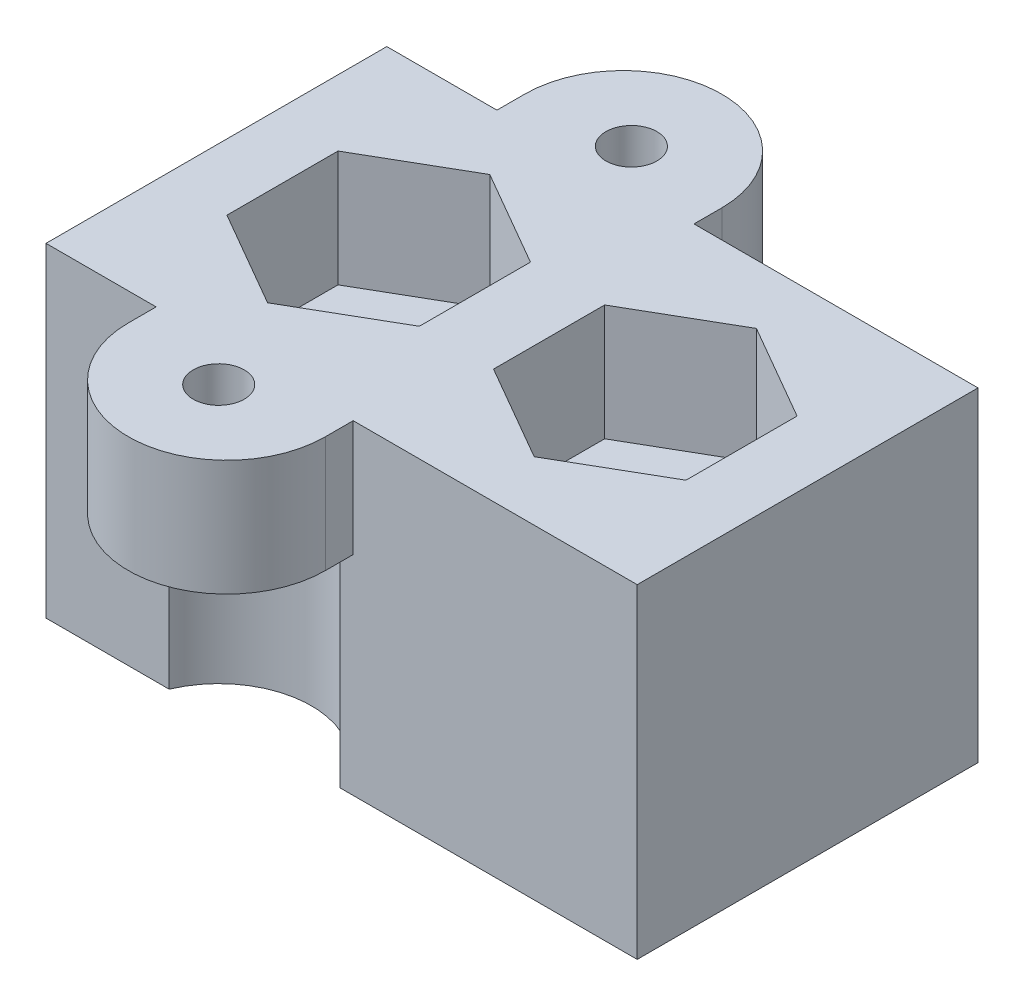
ISO-10303-21;
HEADER;
FILE_DESCRIPTION(('STEP AP214'),'2;1');
FILE_NAME('part.step','',(''),(''),'','','');
FILE_SCHEMA(('AUTOMOTIVE_DESIGN { 1 0 10303 214 1 1 1 1 }'));
ENDSEC;
DATA;
#1=APPLICATION_CONTEXT('core data for automotive mechanical design processes');
#2=APPLICATION_PROTOCOL_DEFINITION('international standard','automotive_design',2000,#1);
#3=PRODUCT_CONTEXT('',#1,'mechanical');
#4=PRODUCT('Part','Part','',(#3));
#5=PRODUCT_RELATED_PRODUCT_CATEGORY('part','',(#4));
#6=PRODUCT_DEFINITION_FORMATION('','',#4);
#7=PRODUCT_DEFINITION_CONTEXT('part definition',#1,'design');
#8=PRODUCT_DEFINITION('design','',#6,#7);
#9=PRODUCT_DEFINITION_SHAPE('','',#8);
#10=(LENGTH_UNIT() NAMED_UNIT(*) SI_UNIT(.MILLI.,.METRE.));
#11=(NAMED_UNIT(*) PLANE_ANGLE_UNIT() SI_UNIT($,.RADIAN.));
#12=(NAMED_UNIT(*) SI_UNIT($,.STERADIAN.) SOLID_ANGLE_UNIT());
#13=UNCERTAINTY_MEASURE_WITH_UNIT(LENGTH_MEASURE(1.E-05),#10,'distance_accuracy_value','');
#14=(GEOMETRIC_REPRESENTATION_CONTEXT(3) GLOBAL_UNCERTAINTY_ASSIGNED_CONTEXT((#13)) GLOBAL_UNIT_ASSIGNED_CONTEXT((#10,
#11,#12)) REPRESENTATION_CONTEXT('',''));
#15=CARTESIAN_POINT('',(0.,0.,0.));
#16=DIRECTION('',(0.,0.,1.));
#17=DIRECTION('',(1.,0.,0.));
#18=AXIS2_PLACEMENT_3D('',#15,#16,#17);
#19=CARTESIAN_POINT('',(11.0405831282105,0.,0.));
#20=DIRECTION('',(0.,-1.,0.));
#21=DIRECTION('',(0.,0.,-1.));
#22=AXIS2_PLACEMENT_3D('',#19,#20,#21);
#23=CYLINDRICAL_SURFACE('',#22,2.65);
#24=CARTESIAN_POINT('',(11.0405831282105,0.,0.));
#25=DIRECTION('',(0.,-1.,0.));
#26=DIRECTION('',(0.,0.,-1.));
#27=AXIS2_PLACEMENT_3D('',#24,#25,#26);
#28=CIRCLE('',#27,2.65);
#29=CARTESIAN_POINT('',(11.0405831282105,0.,-2.65));
#30=VERTEX_POINT('',#29);
#31=EDGE_CURVE('E329',#30,#30,#28,.T.);
#32=ORIENTED_EDGE('',*,*,#31,.T.);
#33=EDGE_LOOP('',(#32));
#34=FACE_BOUND('',#33,.T.);
#35=CARTESIAN_POINT('',(11.0405831282105,9.,0.));
#36=DIRECTION('',(0.,1.,0.));
#37=DIRECTION('',(0.,0.,1.));
#38=AXIS2_PLACEMENT_3D('',#35,#36,#37);
#39=CIRCLE('',#38,2.65);
#40=CARTESIAN_POINT('',(11.0405831282105,9.,2.65));
#41=VERTEX_POINT('',#40);
#42=EDGE_CURVE('E42',#41,#41,#39,.F.);
#43=ORIENTED_EDGE('',*,*,#42,.F.);
#44=EDGE_LOOP('',(#43));
#45=FACE_BOUND('',#44,.T.);
#46=ADVANCED_FACE('F37',(#34,#45),#23,.F.);
#47=CARTESIAN_POINT('',(22.5405831282105,0.,0.));
#48=DIRECTION('',(0.,-1.,0.));
#49=DIRECTION('',(0.,0.,-1.));
#50=AXIS2_PLACEMENT_3D('',#47,#48,#49);
#51=CYLINDRICAL_SURFACE('',#50,2.65);
#52=CARTESIAN_POINT('',(22.5405831282105,0.,0.));
#53=DIRECTION('',(0.,-1.,0.));
#54=DIRECTION('',(0.,0.,-1.));
#55=AXIS2_PLACEMENT_3D('',#52,#53,#54);
#56=CIRCLE('',#55,2.65);
#57=CARTESIAN_POINT('',(22.5405831282105,0.,-2.65));
#58=VERTEX_POINT('',#57);
#59=EDGE_CURVE('E326',#58,#58,#56,.T.);
#60=ORIENTED_EDGE('',*,*,#59,.T.);
#61=EDGE_LOOP('',(#60));
#62=FACE_BOUND('',#61,.T.);
#63=CARTESIAN_POINT('',(22.5405831282105,9.,0.));
#64=DIRECTION('',(0.,1.,0.));
#65=DIRECTION('',(0.,0.,1.));
#66=AXIS2_PLACEMENT_3D('',#63,#64,#65);
#67=CIRCLE('',#66,2.65);
#68=CARTESIAN_POINT('',(22.5405831282105,9.,2.65));
#69=VERTEX_POINT('',#68);
#70=EDGE_CURVE('E273',#69,#69,#67,.F.);
#71=ORIENTED_EDGE('',*,*,#70,.F.);
#72=EDGE_LOOP('',(#71));
#73=FACE_BOUND('',#72,.T.);
#74=ADVANCED_FACE('F464',(#62,#73),#51,.F.);
#75=CARTESIAN_POINT('',(4.04058312821053,14.,7.35));
#76=DIRECTION('',(0.,0.,-1.));
#77=DIRECTION('',(-1.,0.,0.));
#78=AXIS2_PLACEMENT_3D('',#75,#76,#77);
#79=PLANE('',#78);
#80=DIRECTION('',(0.,-1.,0.));
#81=VECTOR('',#80,1.);
#82=CARTESIAN_POINT('',(16.728061941709,20.3137084989848,7.35));
#83=LINE('',#82,#81);
#84=CARTESIAN_POINT('',(16.728061941709,0.,7.35));
#85=VERTEX_POINT('',#84);
#86=CARTESIAN_POINT('',(16.728061941709,9.,7.35));
#87=VERTEX_POINT('',#86);
#88=EDGE_CURVE('E340',#85,#87,#83,.F.);
#89=ORIENTED_EDGE('',*,*,#88,.F.);
#90=DIRECTION('',(1.,0.,0.));
#91=VECTOR('',#90,1.);
#92=CARTESIAN_POINT('',(4.04058312821053,0.,7.35));
#93=LINE('',#92,#91);
#94=CARTESIAN_POINT('',(29.5405831282105,0.,7.35));
#95=VERTEX_POINT('',#94);
#96=EDGE_CURVE('E421',#85,#95,#93,.T.);
#97=ORIENTED_EDGE('',*,*,#96,.T.);
#98=DIRECTION('',(0.,-1.,0.));
#99=VECTOR('',#98,1.);
#100=CARTESIAN_POINT('',(29.5405831282105,14.,7.35));
#101=LINE('',#100,#99);
#102=CARTESIAN_POINT('',(29.5405831282105,14.,7.35));
#103=VERTEX_POINT('',#102);
#104=EDGE_CURVE('E435',#103,#95,#101,.T.);
#105=ORIENTED_EDGE('',*,*,#104,.F.);
#106=DIRECTION('',(1.,0.,0.));
#107=VECTOR('',#106,1.);
#108=CARTESIAN_POINT('',(4.04058312821053,14.,7.35));
#109=LINE('',#108,#107);
#110=CARTESIAN_POINT('',(17.2905831282105,14.,7.35));
#111=VERTEX_POINT('',#110);
#112=EDGE_CURVE('E407',#111,#103,#109,.T.);
#113=ORIENTED_EDGE('',*,*,#112,.F.);
#114=DIRECTION('',(0.,1.,0.));
#115=VECTOR('',#114,1.);
#116=CARTESIAN_POINT('',(17.2905831282105,9.,7.35));
#117=LINE('',#116,#115);
#118=CARTESIAN_POINT('',(17.2905831282105,9.,7.35));
#119=VERTEX_POINT('',#118);
#120=EDGE_CURVE('E359',#119,#111,#117,.T.);
#121=ORIENTED_EDGE('',*,*,#120,.F.);
#122=DIRECTION('',(-1.,0.,0.));
#123=VECTOR('',#122,1.);
#124=CARTESIAN_POINT('',(8.79058312821052,9.,7.35));
#125=LINE('',#124,#123);
#126=EDGE_CURVE('E354',#119,#87,#125,.T.);
#127=ORIENTED_EDGE('',*,*,#126,.T.);
#128=EDGE_LOOP('',(#89,#97,#105,#113,#121,#127));
#129=FACE_BOUND('',#128,.T.);
#130=ADVANCED_FACE('F470',(#129),#79,.F.);
#131=DIRECTION('',(0.,-1.,0.));
#132=VECTOR('',#131,1.);
#133=CARTESIAN_POINT('',(9.35310431471207,20.3137084989848,7.35));
#134=LINE('',#133,#132);
#135=CARTESIAN_POINT('',(9.35310431471207,9.,7.35));
#136=VERTEX_POINT('',#135);
#137=CARTESIAN_POINT('',(9.35310431471207,0.,7.35));
#138=VERTEX_POINT('',#137);
#139=EDGE_CURVE('E338',#136,#138,#134,.T.);
#140=ORIENTED_EDGE('',*,*,#139,.F.);
#141=CARTESIAN_POINT('',(8.79058312821052,9.,7.35));
#142=VERTEX_POINT('',#141);
#143=EDGE_CURVE('E352',#136,#142,#125,.T.);
#144=ORIENTED_EDGE('',*,*,#143,.T.);
#145=DIRECTION('',(0.,1.,0.));
#146=VECTOR('',#145,1.);
#147=CARTESIAN_POINT('',(8.79058312821052,9.,7.35));
#148=LINE('',#147,#146);
#149=CARTESIAN_POINT('',(8.79058312821052,14.,7.35));
#150=VERTEX_POINT('',#149);
#151=EDGE_CURVE('E365',#142,#150,#148,.T.);
#152=ORIENTED_EDGE('',*,*,#151,.T.);
#153=CARTESIAN_POINT('',(4.04058312821053,14.,7.35));
#154=VERTEX_POINT('',#153);
#155=EDGE_CURVE('E409',#154,#150,#109,.T.);
#156=ORIENTED_EDGE('',*,*,#155,.F.);
#157=DIRECTION('',(0.,-1.,0.));
#158=VECTOR('',#157,1.);
#159=CARTESIAN_POINT('',(4.04058312821053,14.,7.35));
#160=LINE('',#159,#158);
#161=CARTESIAN_POINT('',(4.04058312821053,0.,7.35));
#162=VERTEX_POINT('',#161);
#163=EDGE_CURVE('E438',#154,#162,#160,.T.);
#164=ORIENTED_EDGE('',*,*,#163,.T.);
#165=EDGE_CURVE('E422',#162,#138,#93,.T.);
#166=ORIENTED_EDGE('',*,*,#165,.T.);
#167=EDGE_LOOP('',(#140,#144,#152,#156,#164,#166));
#168=FACE_BOUND('',#167,.T.);
#169=ADVANCED_FACE('F537',(#168),#79,.F.);
#170=CARTESIAN_POINT('',(13.0405831282105,9.,8.55));
#171=DIRECTION('',(0.,1.,0.));
#172=DIRECTION('',(0.,0.,1.));
#173=AXIS2_PLACEMENT_3D('',#170,#171,#172);
#174=CYLINDRICAL_SURFACE('',#173,4.25);
#175=DIRECTION('',(0.,1.,0.));
#176=VECTOR('',#175,1.);
#177=CARTESIAN_POINT('',(8.79058312821052,9.,8.55));
#178=LINE('',#177,#176);
#179=CARTESIAN_POINT('',(8.79058312821052,9.,8.55));
#180=VERTEX_POINT('',#179);
#181=CARTESIAN_POINT('',(8.79058312821052,14.,8.55));
#182=VERTEX_POINT('',#181);
#183=EDGE_CURVE('E451',#180,#182,#178,.T.);
#184=ORIENTED_EDGE('',*,*,#183,.F.);
#185=CARTESIAN_POINT('',(13.0405831282105,9.,8.55));
#186=DIRECTION('',(0.,-1.,0.));
#187=DIRECTION('',(0.,0.,-1.));
#188=AXIS2_PLACEMENT_3D('',#185,#186,#187);
#189=CIRCLE('',#188,4.25);
#190=CARTESIAN_POINT('',(17.2905831282105,9.,8.55));
#191=VERTEX_POINT('',#190);
#192=EDGE_CURVE('E47',#191,#180,#189,.T.);
#193=ORIENTED_EDGE('',*,*,#192,.F.);
#194=DIRECTION('',(0.,1.,0.));
#195=VECTOR('',#194,1.);
#196=CARTESIAN_POINT('',(17.2905831282105,9.,8.55));
#197=LINE('',#196,#195);
#198=CARTESIAN_POINT('',(17.2905831282105,14.,8.55));
#199=VERTEX_POINT('',#198);
#200=EDGE_CURVE('E454',#199,#191,#197,.F.);
#201=ORIENTED_EDGE('',*,*,#200,.F.);
#202=CARTESIAN_POINT('',(13.0405831282105,14.,8.55));
#203=DIRECTION('',(0.,-1.,0.));
#204=DIRECTION('',(0.,0.,-1.));
#205=AXIS2_PLACEMENT_3D('',#202,#203,#204);
#206=CIRCLE('',#205,4.25);
#207=EDGE_CURVE('E11',#182,#199,#206,.F.);
#208=ORIENTED_EDGE('',*,*,#207,.F.);
#209=EDGE_LOOP('',(#184,#193,#201,#208));
#210=FACE_BOUND('',#209,.T.);
#211=ADVANCED_FACE('F40',(#210),#174,.T.);
#212=CARTESIAN_POINT('',(4.04058312821053,14.,-7.35));
#213=DIRECTION('',(0.,0.,1.));
#214=DIRECTION('',(1.,0.,0.));
#215=AXIS2_PLACEMENT_3D('',#212,#213,#214);
#216=PLANE('',#215);
#217=DIRECTION('',(-1.,0.,0.));
#218=VECTOR('',#217,1.);
#219=CARTESIAN_POINT('',(8.79058312821052,9.,-7.35));
#220=LINE('',#219,#218);
#221=CARTESIAN_POINT('',(9.35310431471207,9.,-7.35));
#222=VERTEX_POINT('',#221);
#223=CARTESIAN_POINT('',(8.79058312821052,9.,-7.35));
#224=VERTEX_POINT('',#223);
#225=EDGE_CURVE('E391',#222,#224,#220,.T.);
#226=ORIENTED_EDGE('',*,*,#225,.F.);
#227=DIRECTION('',(0.,-1.,0.));
#228=VECTOR('',#227,1.);
#229=CARTESIAN_POINT('',(9.35310431471207,20.3137084989848,-7.35));
#230=LINE('',#229,#228);
#231=CARTESIAN_POINT('',(9.35310431471207,0.,-7.35));
#232=VERTEX_POINT('',#231);
#233=EDGE_CURVE('E375',#222,#232,#230,.T.);
#234=ORIENTED_EDGE('',*,*,#233,.T.);
#235=DIRECTION('',(-1.,0.,0.));
#236=VECTOR('',#235,1.);
#237=CARTESIAN_POINT('',(4.04058312821053,0.,-7.35));
#238=LINE('',#237,#236);
#239=CARTESIAN_POINT('',(4.04058312821053,0.,-7.35));
#240=VERTEX_POINT('',#239);
#241=EDGE_CURVE('E427',#232,#240,#238,.T.);
#242=ORIENTED_EDGE('',*,*,#241,.T.);
#243=DIRECTION('',(0.,-1.,0.));
#244=VECTOR('',#243,1.);
#245=CARTESIAN_POINT('',(4.04058312821053,14.,-7.35));
#246=LINE('',#245,#244);
#247=CARTESIAN_POINT('',(4.04058312821053,14.,-7.35));
#248=VERTEX_POINT('',#247);
#249=EDGE_CURVE('E418',#248,#240,#246,.T.);
#250=ORIENTED_EDGE('',*,*,#249,.F.);
#251=DIRECTION('',(-1.,0.,0.));
#252=VECTOR('',#251,1.);
#253=CARTESIAN_POINT('',(4.04058312821053,14.,-7.35));
#254=LINE('',#253,#252);
#255=CARTESIAN_POINT('',(8.79058312821052,14.,-7.35));
#256=VERTEX_POINT('',#255);
#257=EDGE_CURVE('E414',#256,#248,#254,.T.);
#258=ORIENTED_EDGE('',*,*,#257,.F.);
#259=DIRECTION('',(0.,1.,0.));
#260=VECTOR('',#259,1.);
#261=CARTESIAN_POINT('',(8.79058312821052,9.,-7.35));
#262=LINE('',#261,#260);
#263=EDGE_CURVE('E395',#224,#256,#262,.T.);
#264=ORIENTED_EDGE('',*,*,#263,.F.);
#265=EDGE_LOOP('',(#226,#234,#242,#250,#258,#264));
#266=FACE_BOUND('',#265,.T.);
#267=ADVANCED_FACE('F531',(#266),#216,.F.);
#268=CARTESIAN_POINT('',(13.0405831282105,14.,-8.55));
#269=DIRECTION('',(0.,1.,0.));
#270=DIRECTION('',(0.,0.,1.));
#271=AXIS2_PLACEMENT_3D('',#268,#269,#270);
#272=CYLINDRICAL_SURFACE('',#271,4.25);
#273=DIRECTION('',(0.,1.,0.));
#274=VECTOR('',#273,1.);
#275=CARTESIAN_POINT('',(8.79058312821052,9.,-8.55));
#276=LINE('',#275,#274);
#277=CARTESIAN_POINT('',(8.79058312821052,14.,-8.55));
#278=VERTEX_POINT('',#277);
#279=CARTESIAN_POINT('',(8.79058312821052,9.,-8.55));
#280=VERTEX_POINT('',#279);
#281=EDGE_CURVE('E441',#278,#280,#276,.F.);
#282=ORIENTED_EDGE('',*,*,#281,.F.);
#283=CARTESIAN_POINT('',(13.0405831282105,14.,-8.55));
#284=DIRECTION('',(0.,-1.,0.));
#285=DIRECTION('',(0.,0.,-1.));
#286=AXIS2_PLACEMENT_3D('',#283,#284,#285);
#287=CIRCLE('',#286,4.25);
#288=CARTESIAN_POINT('',(17.2905831282105,14.,-8.55));
#289=VERTEX_POINT('',#288);
#290=EDGE_CURVE('E447',#289,#278,#287,.F.);
#291=ORIENTED_EDGE('',*,*,#290,.F.);
#292=DIRECTION('',(0.,1.,0.));
#293=VECTOR('',#292,1.);
#294=CARTESIAN_POINT('',(17.2905831282105,9.,-8.55));
#295=LINE('',#294,#293);
#296=CARTESIAN_POINT('',(17.2905831282105,9.,-8.55));
#297=VERTEX_POINT('',#296);
#298=EDGE_CURVE('E444',#297,#289,#295,.T.);
#299=ORIENTED_EDGE('',*,*,#298,.F.);
#300=CARTESIAN_POINT('',(13.0405831282105,9.,-8.55));
#301=DIRECTION('',(0.,-1.,0.));
#302=DIRECTION('',(0.,0.,-1.));
#303=AXIS2_PLACEMENT_3D('',#300,#301,#302);
#304=CIRCLE('',#303,4.25);
#305=EDGE_CURVE('E449',#280,#297,#304,.T.);
#306=ORIENTED_EDGE('',*,*,#305,.F.);
#307=EDGE_LOOP('',(#282,#291,#299,#306));
#308=FACE_BOUND('',#307,.T.);
#309=ADVANCED_FACE('F529',(#308),#272,.T.);
#310=CARTESIAN_POINT('',(29.5405831282105,0.,-7.35));
#311=VERTEX_POINT('',#310);
#312=CARTESIAN_POINT('',(16.728061941709,0.,-7.35));
#313=VERTEX_POINT('',#312);
#314=EDGE_CURVE('E408',#311,#313,#238,.T.);
#315=ORIENTED_EDGE('',*,*,#314,.T.);
#316=DIRECTION('',(0.,-1.,0.));
#317=VECTOR('',#316,1.);
#318=CARTESIAN_POINT('',(16.728061941709,20.3137084989848,-7.35));
#319=LINE('',#318,#317);
#320=CARTESIAN_POINT('',(16.728061941709,9.,-7.35));
#321=VERTEX_POINT('',#320);
#322=EDGE_CURVE('E372',#313,#321,#319,.F.);
#323=ORIENTED_EDGE('',*,*,#322,.T.);
#324=CARTESIAN_POINT('',(17.2905831282105,9.,-7.35));
#325=VERTEX_POINT('',#324);
#326=EDGE_CURVE('E392',#325,#321,#220,.T.);
#327=ORIENTED_EDGE('',*,*,#326,.F.);
#328=DIRECTION('',(0.,1.,0.));
#329=VECTOR('',#328,1.);
#330=CARTESIAN_POINT('',(17.2905831282105,9.,-7.35));
#331=LINE('',#330,#329);
#332=CARTESIAN_POINT('',(17.2905831282105,14.,-7.35));
#333=VERTEX_POINT('',#332);
#334=EDGE_CURVE('E400',#325,#333,#331,.T.);
#335=ORIENTED_EDGE('',*,*,#334,.T.);
#336=CARTESIAN_POINT('',(29.5405831282105,14.,-7.35));
#337=VERTEX_POINT('',#336);
#338=EDGE_CURVE('E415',#337,#333,#254,.T.);
#339=ORIENTED_EDGE('',*,*,#338,.F.);
#340=DIRECTION('',(0.,-1.,0.));
#341=VECTOR('',#340,1.);
#342=CARTESIAN_POINT('',(29.5405831282105,14.,-7.35));
#343=LINE('',#342,#341);
#344=EDGE_CURVE('E432',#337,#311,#343,.T.);
#345=ORIENTED_EDGE('',*,*,#344,.T.);
#346=EDGE_LOOP('',(#315,#323,#327,#335,#339,#345));
#347=FACE_BOUND('',#346,.T.);
#348=ADVANCED_FACE('F525',(#347),#216,.F.);
#349=CARTESIAN_POINT('',(4.04058312821053,14.,7.35));
#350=DIRECTION('',(1.,0.,0.));
#351=DIRECTION('',(0.,0.,-1.));
#352=AXIS2_PLACEMENT_3D('',#349,#350,#351);
#353=PLANE('',#352);
#354=DIRECTION('',(0.,0.,1.));
#355=VECTOR('',#354,1.);
#356=CARTESIAN_POINT('',(4.04058312821053,0.,7.35));
#357=LINE('',#356,#355);
#358=EDGE_CURVE('E403',#240,#162,#357,.T.);
#359=ORIENTED_EDGE('',*,*,#358,.T.);
#360=ORIENTED_EDGE('',*,*,#163,.F.);
#361=DIRECTION('',(0.,0.,1.));
#362=VECTOR('',#361,1.);
#363=CARTESIAN_POINT('',(4.04058312821053,14.,7.35));
#364=LINE('',#363,#362);
#365=EDGE_CURVE('E404',#248,#154,#364,.T.);
#366=ORIENTED_EDGE('',*,*,#365,.F.);
#367=ORIENTED_EDGE('',*,*,#249,.T.);
#368=EDGE_LOOP('',(#359,#360,#366,#367));
#369=FACE_BOUND('',#368,.T.);
#370=ADVANCED_FACE('F528',(#369),#353,.F.);
#371=CARTESIAN_POINT('',(29.5405831282105,14.,7.35));
#372=DIRECTION('',(-1.,0.,0.));
#373=DIRECTION('',(0.,0.,1.));
#374=AXIS2_PLACEMENT_3D('',#371,#372,#373);
#375=PLANE('',#374);
#376=DIRECTION('',(0.,0.,-1.));
#377=VECTOR('',#376,1.);
#378=CARTESIAN_POINT('',(29.5405831282105,0.,7.35));
#379=LINE('',#378,#377);
#380=EDGE_CURVE('E425',#95,#311,#379,.T.);
#381=ORIENTED_EDGE('',*,*,#380,.T.);
#382=ORIENTED_EDGE('',*,*,#344,.F.);
#383=DIRECTION('',(0.,0.,-1.));
#384=VECTOR('',#383,1.);
#385=CARTESIAN_POINT('',(29.5405831282105,14.,7.35));
#386=LINE('',#385,#384);
#387=EDGE_CURVE('E412',#103,#337,#386,.T.);
#388=ORIENTED_EDGE('',*,*,#387,.F.);
#389=ORIENTED_EDGE('',*,*,#104,.T.);
#390=EDGE_LOOP('',(#381,#382,#388,#389));
#391=FACE_BOUND('',#390,.T.);
#392=ADVANCED_FACE('F520',(#391),#375,.F.);
#393=CARTESIAN_POINT('',(0.,14.,0.));
#394=DIRECTION('',(0.,-1.,0.));
#395=DIRECTION('',(0.,0.,-1.));
#396=AXIS2_PLACEMENT_3D('',#393,#394,#395);
#397=PLANE('',#396);
#398=DIRECTION('',(-0.866025403784438,0.,0.5));
#399=VECTOR('',#398,1.);
#400=CARTESIAN_POINT('',(11.0405831282105,14.,-4.79200723427389));
#401=LINE('',#400,#399);
#402=CARTESIAN_POINT('',(11.0405831282105,14.,-4.79200723427389));
#403=VERTEX_POINT('',#402);
#404=CARTESIAN_POINT('',(6.89058312821053,14.,-2.39600361713695));
#405=VERTEX_POINT('',#404);
#406=EDGE_CURVE('E260',#403,#405,#401,.T.);
#407=ORIENTED_EDGE('',*,*,#406,.F.);
#408=DIRECTION('',(-0.866025403784439,0.,-0.5));
#409=VECTOR('',#408,1.);
#410=CARTESIAN_POINT('',(15.1905831282105,14.,-2.39600361713695));
#411=LINE('',#410,#409);
#412=CARTESIAN_POINT('',(15.1905831282105,14.,-2.39600361713695));
#413=VERTEX_POINT('',#412);
#414=EDGE_CURVE('E55',#413,#403,#411,.T.);
#415=ORIENTED_EDGE('',*,*,#414,.F.);
#416=DIRECTION('',(0.,0.,-1.));
#417=VECTOR('',#416,1.);
#418=CARTESIAN_POINT('',(15.1905831282105,14.,2.39600361713695));
#419=LINE('',#418,#417);
#420=CARTESIAN_POINT('',(15.1905831282105,14.,2.39600361713695));
#421=VERTEX_POINT('',#420);
#422=EDGE_CURVE('E246',#421,#413,#419,.T.);
#423=ORIENTED_EDGE('',*,*,#422,.F.);
#424=DIRECTION('',(0.866025403784439,0.,-0.5));
#425=VECTOR('',#424,1.);
#426=CARTESIAN_POINT('',(11.0405831282105,14.,4.79200723427389));
#427=LINE('',#426,#425);
#428=CARTESIAN_POINT('',(11.0405831282105,14.,4.79200723427389));
#429=VERTEX_POINT('',#428);
#430=EDGE_CURVE('E249',#429,#421,#427,.T.);
#431=ORIENTED_EDGE('',*,*,#430,.F.);
#432=DIRECTION('',(0.866025403784439,0.,0.5));
#433=VECTOR('',#432,1.);
#434=CARTESIAN_POINT('',(6.89058312821053,14.,2.39600361713695));
#435=LINE('',#434,#433);
#436=CARTESIAN_POINT('',(6.89058312821053,14.,2.39600361713695));
#437=VERTEX_POINT('',#436);
#438=EDGE_CURVE('E266',#437,#429,#435,.T.);
#439=ORIENTED_EDGE('',*,*,#438,.F.);
#440=DIRECTION('',(0.,0.,1.));
#441=VECTOR('',#440,1.);
#442=CARTESIAN_POINT('',(6.89058312821053,14.,-2.39600361713695));
#443=LINE('',#442,#441);
#444=EDGE_CURVE('E263',#405,#437,#443,.T.);
#445=ORIENTED_EDGE('',*,*,#444,.F.);
#446=EDGE_LOOP('',(#407,#415,#423,#431,#439,#445));
#447=FACE_BOUND('',#446,.T.);
#448=DIRECTION('',(-0.866025403784439,0.,0.5));
#449=VECTOR('',#448,1.);
#450=CARTESIAN_POINT('',(22.5405831282105,14.,-4.79200723427389));
#451=LINE('',#450,#449);
#452=CARTESIAN_POINT('',(22.5405831282105,14.,-4.79200723427389));
#453=VERTEX_POINT('',#452);
#454=CARTESIAN_POINT('',(18.3905831282105,14.,-2.39600361713695));
#455=VERTEX_POINT('',#454);
#456=EDGE_CURVE('E302',#453,#455,#451,.T.);
#457=ORIENTED_EDGE('',*,*,#456,.F.);
#458=DIRECTION('',(-0.866025403784439,0.,-0.5));
#459=VECTOR('',#458,1.);
#460=CARTESIAN_POINT('',(26.6905831282105,14.,-2.39600361713695));
#461=LINE('',#460,#459);
#462=CARTESIAN_POINT('',(26.6905831282105,14.,-2.39600361713695));
#463=VERTEX_POINT('',#462);
#464=EDGE_CURVE('E63',#463,#453,#461,.T.);
#465=ORIENTED_EDGE('',*,*,#464,.F.);
#466=DIRECTION('',(0.,0.,-1.));
#467=VECTOR('',#466,1.);
#468=CARTESIAN_POINT('',(26.6905831282105,14.,2.39600361713694));
#469=LINE('',#468,#467);
#470=CARTESIAN_POINT('',(26.6905831282105,14.,2.39600361713694));
#471=VERTEX_POINT('',#470);
#472=EDGE_CURVE('E285',#471,#463,#469,.T.);
#473=ORIENTED_EDGE('',*,*,#472,.F.);
#474=DIRECTION('',(0.866025403784439,0.,-0.5));
#475=VECTOR('',#474,1.);
#476=CARTESIAN_POINT('',(22.5405831282105,14.,4.79200723427389));
#477=LINE('',#476,#475);
#478=CARTESIAN_POINT('',(22.5405831282105,14.,4.79200723427389));
#479=VERTEX_POINT('',#478);
#480=EDGE_CURVE('E311',#479,#471,#477,.T.);
#481=ORIENTED_EDGE('',*,*,#480,.F.);
#482=DIRECTION('',(0.866025403784439,0.,0.5));
#483=VECTOR('',#482,1.);
#484=CARTESIAN_POINT('',(18.3905831282105,14.,2.39600361713694));
#485=LINE('',#484,#483);
#486=CARTESIAN_POINT('',(18.3905831282105,14.,2.39600361713694));
#487=VERTEX_POINT('',#486);
#488=EDGE_CURVE('E308',#487,#479,#485,.T.);
#489=ORIENTED_EDGE('',*,*,#488,.F.);
#490=DIRECTION('',(0.,0.,1.));
#491=VECTOR('',#490,1.);
#492=CARTESIAN_POINT('',(18.3905831282105,14.,-2.39600361713695));
#493=LINE('',#492,#491);
#494=EDGE_CURVE('E305',#455,#487,#493,.T.);
#495=ORIENTED_EDGE('',*,*,#494,.F.);
#496=EDGE_LOOP('',(#457,#465,#473,#481,#489,#495));
#497=FACE_BOUND('',#496,.T.);
#498=CARTESIAN_POINT('',(13.0405831282105,14.,8.9));
#499=DIRECTION('',(0.,-1.,0.));
#500=DIRECTION('',(0.,0.,-1.));
#501=AXIS2_PLACEMENT_3D('',#498,#499,#500);
#502=CIRCLE('',#501,1.1);
#503=CARTESIAN_POINT('',(13.0405831282105,14.,7.8));
#504=VERTEX_POINT('',#503);
#505=EDGE_CURVE('E345',#504,#504,#502,.T.);
#506=ORIENTED_EDGE('',*,*,#505,.T.);
#507=EDGE_LOOP('',(#506));
#508=FACE_BOUND('',#507,.T.);
#509=CARTESIAN_POINT('',(13.0405831282105,14.,-8.9));
#510=DIRECTION('',(0.,-1.,0.));
#511=DIRECTION('',(0.,0.,-1.));
#512=AXIS2_PLACEMENT_3D('',#509,#510,#511);
#513=CIRCLE('',#512,1.1);
#514=CARTESIAN_POINT('',(13.0405831282105,14.,-10.));
#515=VERTEX_POINT('',#514);
#516=EDGE_CURVE('E381',#515,#515,#513,.T.);
#517=ORIENTED_EDGE('',*,*,#516,.T.);
#518=EDGE_LOOP('',(#517));
#519=FACE_BOUND('',#518,.T.);
#520=DIRECTION('',(0.,0.,1.));
#521=VECTOR('',#520,1.);
#522=CARTESIAN_POINT('',(8.79058312821052,14.,7.35));
#523=LINE('',#522,#521);
#524=EDGE_CURVE('E348',#150,#182,#523,.T.);
#525=ORIENTED_EDGE('',*,*,#524,.T.);
#526=ORIENTED_EDGE('',*,*,#207,.T.);
#527=DIRECTION('',(0.,0.,-1.));
#528=VECTOR('',#527,1.);
#529=CARTESIAN_POINT('',(17.2905831282105,14.,7.35));
#530=LINE('',#529,#528);
#531=EDGE_CURVE('E353',#199,#111,#530,.T.);
#532=ORIENTED_EDGE('',*,*,#531,.T.);
#533=ORIENTED_EDGE('',*,*,#112,.T.);
#534=ORIENTED_EDGE('',*,*,#387,.T.);
#535=ORIENTED_EDGE('',*,*,#338,.T.);
#536=DIRECTION('',(0.,0.,1.));
#537=VECTOR('',#536,1.);
#538=CARTESIAN_POINT('',(17.2905831282105,14.,-7.35));
#539=LINE('',#538,#537);
#540=EDGE_CURVE('E389',#289,#333,#539,.T.);
#541=ORIENTED_EDGE('',*,*,#540,.F.);
#542=ORIENTED_EDGE('',*,*,#290,.T.);
#543=DIRECTION('',(0.,0.,-1.));
#544=VECTOR('',#543,1.);
#545=CARTESIAN_POINT('',(8.79058312821052,14.,-7.35));
#546=LINE('',#545,#544);
#547=EDGE_CURVE('E384',#256,#278,#546,.T.);
#548=ORIENTED_EDGE('',*,*,#547,.F.);
#549=ORIENTED_EDGE('',*,*,#257,.T.);
#550=ORIENTED_EDGE('',*,*,#365,.T.);
#551=ORIENTED_EDGE('',*,*,#155,.T.);
#552=EDGE_LOOP('',(#525,#526,#532,#533,#534,#535,#541,#542,#548,#549,#550,#551));
#553=FACE_BOUND('',#552,.T.);
#554=ADVANCED_FACE('F517',(#447,#497,#508,#519,#553),#397,.F.);
#555=CARTESIAN_POINT('',(0.,0.,0.));
#556=DIRECTION('',(0.,-1.,0.));
#557=DIRECTION('',(0.,0.,-1.));
#558=AXIS2_PLACEMENT_3D('',#555,#556,#557);
#559=PLANE('',#558);
#560=ORIENTED_EDGE('',*,*,#59,.F.);
#561=EDGE_LOOP('',(#560));
#562=FACE_BOUND('',#561,.T.);
#563=ORIENTED_EDGE('',*,*,#31,.F.);
#564=EDGE_LOOP('',(#563));
#565=FACE_BOUND('',#564,.T.);
#566=ORIENTED_EDGE('',*,*,#96,.F.);
#567=CARTESIAN_POINT('',(13.0405831282105,0.,8.9));
#568=DIRECTION('',(0.,1.,0.));
#569=DIRECTION('',(0.,0.,1.));
#570=AXIS2_PLACEMENT_3D('',#567,#568,#569);
#571=CIRCLE('',#570,4.);
#572=EDGE_CURVE('E332',#85,#138,#571,.T.);
#573=ORIENTED_EDGE('',*,*,#572,.T.);
#574=ORIENTED_EDGE('',*,*,#165,.F.);
#575=ORIENTED_EDGE('',*,*,#358,.F.);
#576=ORIENTED_EDGE('',*,*,#241,.F.);
#577=CARTESIAN_POINT('',(13.0405831282105,0.,-8.9));
#578=DIRECTION('',(0.,-1.,0.));
#579=DIRECTION('',(0.,0.,-1.));
#580=AXIS2_PLACEMENT_3D('',#577,#578,#579);
#581=CIRCLE('',#580,4.);
#582=EDGE_CURVE('E368',#313,#232,#581,.T.);
#583=ORIENTED_EDGE('',*,*,#582,.F.);
#584=ORIENTED_EDGE('',*,*,#314,.F.);
#585=ORIENTED_EDGE('',*,*,#380,.F.);
#586=EDGE_LOOP('',(#566,#573,#574,#575,#576,#583,#584,#585));
#587=FACE_BOUND('',#586,.T.);
#588=ADVANCED_FACE('F515',(#562,#565,#587),#559,.T.);
#589=CARTESIAN_POINT('',(8.79058312821052,9.,-7.35));
#590=DIRECTION('',(1.,0.,0.));
#591=DIRECTION('',(0.,0.,-1.));
#592=AXIS2_PLACEMENT_3D('',#589,#590,#591);
#593=PLANE('',#592);
#594=ORIENTED_EDGE('',*,*,#547,.T.);
#595=ORIENTED_EDGE('',*,*,#281,.T.);
#596=DIRECTION('',(0.,0.,-1.));
#597=VECTOR('',#596,1.);
#598=CARTESIAN_POINT('',(8.79058312821052,9.,-7.35));
#599=LINE('',#598,#597);
#600=EDGE_CURVE('E385',#224,#280,#599,.T.);
#601=ORIENTED_EDGE('',*,*,#600,.F.);
#602=ORIENTED_EDGE('',*,*,#263,.T.);
#603=EDGE_LOOP('',(#594,#595,#601,#602));
#604=FACE_BOUND('',#603,.T.);
#605=ADVANCED_FACE('F511',(#604),#593,.F.);
#606=CARTESIAN_POINT('',(17.2905831282105,9.,-7.35));
#607=DIRECTION('',(-1.,0.,0.));
#608=DIRECTION('',(0.,0.,1.));
#609=AXIS2_PLACEMENT_3D('',#606,#607,#608);
#610=PLANE('',#609);
#611=DIRECTION('',(0.,0.,1.));
#612=VECTOR('',#611,1.);
#613=CARTESIAN_POINT('',(17.2905831282105,9.,-7.35));
#614=LINE('',#613,#612);
#615=EDGE_CURVE('E388',#297,#325,#614,.T.);
#616=ORIENTED_EDGE('',*,*,#615,.F.);
#617=ORIENTED_EDGE('',*,*,#298,.T.);
#618=ORIENTED_EDGE('',*,*,#540,.T.);
#619=ORIENTED_EDGE('',*,*,#334,.F.);
#620=EDGE_LOOP('',(#616,#617,#618,#619));
#621=FACE_BOUND('',#620,.T.);
#622=ADVANCED_FACE('F507',(#621),#610,.F.);
#623=CARTESIAN_POINT('',(0.,9.,0.));
#624=DIRECTION('',(0.,-1.,0.));
#625=DIRECTION('',(0.,0.,-1.));
#626=AXIS2_PLACEMENT_3D('',#623,#624,#625);
#627=PLANE('',#626);
#628=ORIENTED_EDGE('',*,*,#305,.T.);
#629=ORIENTED_EDGE('',*,*,#615,.T.);
#630=ORIENTED_EDGE('',*,*,#326,.T.);
#631=CARTESIAN_POINT('',(13.0405831282105,9.,-8.9));
#632=DIRECTION('',(0.,-1.,0.));
#633=DIRECTION('',(0.,0.,-1.));
#634=AXIS2_PLACEMENT_3D('',#631,#632,#633);
#635=CIRCLE('',#634,4.);
#636=EDGE_CURVE('E370',#222,#321,#635,.F.);
#637=ORIENTED_EDGE('',*,*,#636,.F.);
#638=ORIENTED_EDGE('',*,*,#225,.T.);
#639=ORIENTED_EDGE('',*,*,#600,.T.);
#640=EDGE_LOOP('',(#628,#629,#630,#637,#638,#639));
#641=FACE_BOUND('',#640,.T.);
#642=CARTESIAN_POINT('',(13.0405831282105,9.,-8.9));
#643=DIRECTION('',(0.,-1.,0.));
#644=DIRECTION('',(0.,0.,-1.));
#645=AXIS2_PLACEMENT_3D('',#642,#643,#644);
#646=CIRCLE('',#645,1.1);
#647=CARTESIAN_POINT('',(13.0405831282105,9.,-10.));
#648=VERTEX_POINT('',#647);
#649=EDGE_CURVE('E378',#648,#648,#646,.T.);
#650=ORIENTED_EDGE('',*,*,#649,.F.);
#651=EDGE_LOOP('',(#650));
#652=FACE_BOUND('',#651,.T.);
#653=ADVANCED_FACE('F503',(#641,#652),#627,.T.);
#654=CARTESIAN_POINT('',(13.0405831282105,9.,-8.9));
#655=DIRECTION('',(0.,-1.,0.));
#656=DIRECTION('',(0.,0.,-1.));
#657=AXIS2_PLACEMENT_3D('',#654,#655,#656);
#658=CYLINDRICAL_SURFACE('',#657,1.1);
#659=ORIENTED_EDGE('',*,*,#516,.F.);
#660=EDGE_LOOP('',(#659));
#661=FACE_BOUND('',#660,.T.);
#662=ORIENTED_EDGE('',*,*,#649,.T.);
#663=EDGE_LOOP('',(#662));
#664=FACE_BOUND('',#663,.T.);
#665=ADVANCED_FACE('F499',(#661,#664),#658,.F.);
#666=CARTESIAN_POINT('',(13.0405831282105,20.3137084989848,-8.9));
#667=DIRECTION('',(0.,-1.,0.));
#668=DIRECTION('',(0.,0.,-1.));
#669=AXIS2_PLACEMENT_3D('',#666,#667,#668);
#670=CYLINDRICAL_SURFACE('',#669,4.);
#671=ORIENTED_EDGE('',*,*,#636,.T.);
#672=ORIENTED_EDGE('',*,*,#322,.F.);
#673=ORIENTED_EDGE('',*,*,#582,.T.);
#674=ORIENTED_EDGE('',*,*,#233,.F.);
#675=EDGE_LOOP('',(#671,#672,#673,#674));
#676=FACE_BOUND('',#675,.T.);
#677=ADVANCED_FACE('F495',(#676),#670,.F.);
#678=CARTESIAN_POINT('',(8.79058312821052,9.,7.35));
#679=DIRECTION('',(-1.,0.,0.));
#680=DIRECTION('',(0.,0.,1.));
#681=AXIS2_PLACEMENT_3D('',#678,#679,#680);
#682=PLANE('',#681);
#683=DIRECTION('',(0.,0.,1.));
#684=VECTOR('',#683,1.);
#685=CARTESIAN_POINT('',(8.79058312821052,9.,7.35));
#686=LINE('',#685,#684);
#687=EDGE_CURVE('E349',#142,#180,#686,.T.);
#688=ORIENTED_EDGE('',*,*,#687,.T.);
#689=ORIENTED_EDGE('',*,*,#183,.T.);
#690=ORIENTED_EDGE('',*,*,#524,.F.);
#691=ORIENTED_EDGE('',*,*,#151,.F.);
#692=EDGE_LOOP('',(#688,#689,#690,#691));
#693=FACE_BOUND('',#692,.T.);
#694=ADVANCED_FACE('F491',(#693),#682,.T.);
#695=CARTESIAN_POINT('',(17.2905831282105,9.,7.35));
#696=DIRECTION('',(1.,0.,0.));
#697=DIRECTION('',(0.,0.,-1.));
#698=AXIS2_PLACEMENT_3D('',#695,#696,#697);
#699=PLANE('',#698);
#700=ORIENTED_EDGE('',*,*,#531,.F.);
#701=ORIENTED_EDGE('',*,*,#200,.T.);
#702=DIRECTION('',(0.,0.,-1.));
#703=VECTOR('',#702,1.);
#704=CARTESIAN_POINT('',(17.2905831282105,9.,7.35));
#705=LINE('',#704,#703);
#706=EDGE_CURVE('E357',#191,#119,#705,.T.);
#707=ORIENTED_EDGE('',*,*,#706,.T.);
#708=ORIENTED_EDGE('',*,*,#120,.T.);
#709=EDGE_LOOP('',(#700,#701,#707,#708));
#710=FACE_BOUND('',#709,.T.);
#711=ADVANCED_FACE('F487',(#710),#699,.T.);
#712=CARTESIAN_POINT('',(0.,9.,0.));
#713=DIRECTION('',(0.,-1.,0.));
#714=DIRECTION('',(0.,0.,1.));
#715=AXIS2_PLACEMENT_3D('',#712,#713,#714);
#716=PLANE('',#715);
#717=ORIENTED_EDGE('',*,*,#192,.T.);
#718=ORIENTED_EDGE('',*,*,#687,.F.);
#719=ORIENTED_EDGE('',*,*,#143,.F.);
#720=CARTESIAN_POINT('',(13.0405831282105,9.,8.9));
#721=DIRECTION('',(0.,-1.,0.));
#722=DIRECTION('',(0.,0.,-1.));
#723=AXIS2_PLACEMENT_3D('',#720,#721,#722);
#724=CIRCLE('',#723,4.);
#725=EDGE_CURVE('E335',#136,#87,#724,.T.);
#726=ORIENTED_EDGE('',*,*,#725,.T.);
#727=ORIENTED_EDGE('',*,*,#126,.F.);
#728=ORIENTED_EDGE('',*,*,#706,.F.);
#729=EDGE_LOOP('',(#717,#718,#719,#726,#727,#728));
#730=FACE_BOUND('',#729,.T.);
#731=CARTESIAN_POINT('',(13.0405831282105,9.,8.9));
#732=DIRECTION('',(0.,-1.,0.));
#733=DIRECTION('',(0.,0.,-1.));
#734=AXIS2_PLACEMENT_3D('',#731,#732,#733);
#735=CIRCLE('',#734,1.1);
#736=CARTESIAN_POINT('',(13.0405831282105,9.,7.8));
#737=VERTEX_POINT('',#736);
#738=EDGE_CURVE('E342',#737,#737,#735,.T.);
#739=ORIENTED_EDGE('',*,*,#738,.F.);
#740=EDGE_LOOP('',(#739));
#741=FACE_BOUND('',#740,.T.);
#742=ADVANCED_FACE('F483',(#730,#741),#716,.T.);
#743=CARTESIAN_POINT('',(13.0405831282105,9.,8.9));
#744=DIRECTION('',(0.,-1.,0.));
#745=DIRECTION('',(0.,0.,-1.));
#746=AXIS2_PLACEMENT_3D('',#743,#744,#745);
#747=CYLINDRICAL_SURFACE('',#746,1.1);
#748=ORIENTED_EDGE('',*,*,#505,.F.);
#749=EDGE_LOOP('',(#748));
#750=FACE_BOUND('',#749,.T.);
#751=ORIENTED_EDGE('',*,*,#738,.T.);
#752=EDGE_LOOP('',(#751));
#753=FACE_BOUND('',#752,.T.);
#754=ADVANCED_FACE('F479',(#750,#753),#747,.F.);
#755=CARTESIAN_POINT('',(13.0405831282105,20.3137084989848,8.9));
#756=DIRECTION('',(0.,-1.,0.));
#757=DIRECTION('',(0.,0.,-1.));
#758=AXIS2_PLACEMENT_3D('',#755,#756,#757);
#759=CYLINDRICAL_SURFACE('',#758,4.);
#760=ORIENTED_EDGE('',*,*,#88,.T.);
#761=ORIENTED_EDGE('',*,*,#725,.F.);
#762=ORIENTED_EDGE('',*,*,#139,.T.);
#763=ORIENTED_EDGE('',*,*,#572,.F.);
#764=EDGE_LOOP('',(#760,#761,#762,#763));
#765=FACE_BOUND('',#764,.T.);
#766=ADVANCED_FACE('F475',(#765),#759,.F.);
#767=CARTESIAN_POINT('',(0.,9.,0.));
#768=DIRECTION('',(0.,1.,0.));
#769=DIRECTION('',(0.,0.,1.));
#770=AXIS2_PLACEMENT_3D('',#767,#768,#769);
#771=PLANE('',#770);
#772=DIRECTION('',(-0.866025403784439,0.,-0.5));
#773=VECTOR('',#772,1.);
#774=CARTESIAN_POINT('',(26.6905831282105,9.,-2.39600361713695));
#775=LINE('',#774,#773);
#776=CARTESIAN_POINT('',(26.6905831282105,9.,-2.39600361713695));
#777=VERTEX_POINT('',#776);
#778=CARTESIAN_POINT('',(22.5405831282105,9.,-4.79200723427389));
#779=VERTEX_POINT('',#778);
#780=EDGE_CURVE('E281',#777,#779,#775,.T.);
#781=ORIENTED_EDGE('',*,*,#780,.T.);
#782=DIRECTION('',(-0.866025403784439,0.,0.5));
#783=VECTOR('',#782,1.);
#784=CARTESIAN_POINT('',(22.5405831282105,9.,-4.79200723427389));
#785=LINE('',#784,#783);
#786=CARTESIAN_POINT('',(18.3905831282105,9.,-2.39600361713695));
#787=VERTEX_POINT('',#786);
#788=EDGE_CURVE('E284',#779,#787,#785,.T.);
#789=ORIENTED_EDGE('',*,*,#788,.T.);
#790=DIRECTION('',(0.,0.,1.));
#791=VECTOR('',#790,1.);
#792=CARTESIAN_POINT('',(18.3905831282105,9.,-2.39600361713695));
#793=LINE('',#792,#791);
#794=CARTESIAN_POINT('',(18.3905831282105,9.,2.39600361713694));
#795=VERTEX_POINT('',#794);
#796=EDGE_CURVE('E288',#787,#795,#793,.T.);
#797=ORIENTED_EDGE('',*,*,#796,.T.);
#798=DIRECTION('',(0.866025403784439,0.,0.5));
#799=VECTOR('',#798,1.);
#800=CARTESIAN_POINT('',(18.3905831282105,9.,2.39600361713694));
#801=LINE('',#800,#799);
#802=CARTESIAN_POINT('',(22.5405831282105,9.,4.79200723427389));
#803=VERTEX_POINT('',#802);
#804=EDGE_CURVE('E291',#795,#803,#801,.T.);
#805=ORIENTED_EDGE('',*,*,#804,.T.);
#806=DIRECTION('',(0.866025403784439,0.,-0.5));
#807=VECTOR('',#806,1.);
#808=CARTESIAN_POINT('',(22.5405831282105,9.,4.79200723427389));
#809=LINE('',#808,#807);
#810=CARTESIAN_POINT('',(26.6905831282105,9.,2.39600361713694));
#811=VERTEX_POINT('',#810);
#812=EDGE_CURVE('E294',#803,#811,#809,.T.);
#813=ORIENTED_EDGE('',*,*,#812,.T.);
#814=DIRECTION('',(0.,0.,-1.));
#815=VECTOR('',#814,1.);
#816=CARTESIAN_POINT('',(26.6905831282105,9.,2.39600361713694));
#817=LINE('',#816,#815);
#818=EDGE_CURVE('E297',#811,#777,#817,.T.);
#819=ORIENTED_EDGE('',*,*,#818,.T.);
#820=EDGE_LOOP('',(#781,#789,#797,#805,#813,#819));
#821=FACE_BOUND('',#820,.T.);
#822=ORIENTED_EDGE('',*,*,#70,.T.);
#823=EDGE_LOOP('',(#822));
#824=FACE_BOUND('',#823,.T.);
#825=ADVANCED_FACE('F478',(#821,#824),#771,.T.);
#826=CARTESIAN_POINT('',(26.6905831282105,9.,-2.39600361713695));
#827=DIRECTION('',(0.5,0.,-0.866025403784439));
#828=DIRECTION('',(-0.866025403784439,0.,-0.5));
#829=AXIS2_PLACEMENT_3D('',#826,#827,#828);
#830=PLANE('',#829);
#831=ORIENTED_EDGE('',*,*,#464,.T.);
#832=DIRECTION('',(0.,1.,0.));
#833=VECTOR('',#832,1.);
#834=CARTESIAN_POINT('',(22.5405831282105,9.,-4.79200723427389));
#835=LINE('',#834,#833);
#836=EDGE_CURVE('E300',#779,#453,#835,.T.);
#837=ORIENTED_EDGE('',*,*,#836,.F.);
#838=ORIENTED_EDGE('',*,*,#780,.F.);
#839=DIRECTION('',(0.,1.,0.));
#840=VECTOR('',#839,1.);
#841=CARTESIAN_POINT('',(26.6905831282105,9.,-2.39600361713695));
#842=LINE('',#841,#840);
#843=EDGE_CURVE('E261',#777,#463,#842,.T.);
#844=ORIENTED_EDGE('',*,*,#843,.T.);
#845=EDGE_LOOP('',(#831,#837,#838,#844));
#846=FACE_BOUND('',#845,.T.);
#847=ADVANCED_FACE('F632',(#846),#830,.F.);
#848=CARTESIAN_POINT('',(26.6905831282105,9.,2.39600361713694));
#849=DIRECTION('',(1.,0.,0.));
#850=DIRECTION('',(0.,0.,-1.));
#851=AXIS2_PLACEMENT_3D('',#848,#849,#850);
#852=PLANE('',#851);
#853=ORIENTED_EDGE('',*,*,#472,.T.);
#854=ORIENTED_EDGE('',*,*,#843,.F.);
#855=ORIENTED_EDGE('',*,*,#818,.F.);
#856=DIRECTION('',(0.,1.,0.));
#857=VECTOR('',#856,1.);
#858=CARTESIAN_POINT('',(26.6905831282105,9.,2.39600361713694));
#859=LINE('',#858,#857);
#860=EDGE_CURVE('E317',#811,#471,#859,.T.);
#861=ORIENTED_EDGE('',*,*,#860,.T.);
#862=EDGE_LOOP('',(#853,#854,#855,#861));
#863=FACE_BOUND('',#862,.T.);
#864=ADVANCED_FACE('F642',(#863),#852,.F.);
#865=CARTESIAN_POINT('',(22.5405831282105,9.,4.79200723427389));
#866=DIRECTION('',(0.5,0.,0.866025403784439));
#867=DIRECTION('',(0.866025403784439,0.,-0.5));
#868=AXIS2_PLACEMENT_3D('',#865,#866,#867);
#869=PLANE('',#868);
#870=ORIENTED_EDGE('',*,*,#480,.T.);
#871=ORIENTED_EDGE('',*,*,#860,.F.);
#872=ORIENTED_EDGE('',*,*,#812,.F.);
#873=DIRECTION('',(0.,1.,0.));
#874=VECTOR('',#873,1.);
#875=CARTESIAN_POINT('',(22.5405831282105,9.,4.79200723427389));
#876=LINE('',#875,#874);
#877=EDGE_CURVE('E319',#803,#479,#876,.T.);
#878=ORIENTED_EDGE('',*,*,#877,.T.);
#879=EDGE_LOOP('',(#870,#871,#872,#878));
#880=FACE_BOUND('',#879,.T.);
#881=ADVANCED_FACE('F650',(#880),#869,.F.);
#882=CARTESIAN_POINT('',(18.3905831282105,9.,2.39600361713694));
#883=DIRECTION('',(-0.5,0.,0.866025403784439));
#884=DIRECTION('',(0.866025403784439,0.,0.5));
#885=AXIS2_PLACEMENT_3D('',#882,#883,#884);
#886=PLANE('',#885);
#887=ORIENTED_EDGE('',*,*,#488,.T.);
#888=ORIENTED_EDGE('',*,*,#877,.F.);
#889=ORIENTED_EDGE('',*,*,#804,.F.);
#890=DIRECTION('',(0.,1.,0.));
#891=VECTOR('',#890,1.);
#892=CARTESIAN_POINT('',(18.3905831282105,9.,2.39600361713694));
#893=LINE('',#892,#891);
#894=EDGE_CURVE('E321',#795,#487,#893,.T.);
#895=ORIENTED_EDGE('',*,*,#894,.T.);
#896=EDGE_LOOP('',(#887,#888,#889,#895));
#897=FACE_BOUND('',#896,.T.);
#898=ADVANCED_FACE('F660',(#897),#886,.F.);
#899=CARTESIAN_POINT('',(18.3905831282105,9.,-2.39600361713695));
#900=DIRECTION('',(-1.,0.,0.));
#901=DIRECTION('',(0.,0.,1.));
#902=AXIS2_PLACEMENT_3D('',#899,#900,#901);
#903=PLANE('',#902);
#904=ORIENTED_EDGE('',*,*,#494,.T.);
#905=ORIENTED_EDGE('',*,*,#894,.F.);
#906=ORIENTED_EDGE('',*,*,#796,.F.);
#907=DIRECTION('',(0.,1.,0.));
#908=VECTOR('',#907,1.);
#909=CARTESIAN_POINT('',(18.3905831282105,9.,-2.39600361713695));
#910=LINE('',#909,#908);
#911=EDGE_CURVE('E323',#787,#455,#910,.T.);
#912=ORIENTED_EDGE('',*,*,#911,.T.);
#913=EDGE_LOOP('',(#904,#905,#906,#912));
#914=FACE_BOUND('',#913,.T.);
#915=ADVANCED_FACE('F670',(#914),#903,.F.);
#916=CARTESIAN_POINT('',(22.5405831282105,9.,-4.79200723427389));
#917=DIRECTION('',(-0.5,0.,-0.866025403784439));
#918=DIRECTION('',(-0.866025403784439,0.,0.5));
#919=AXIS2_PLACEMENT_3D('',#916,#917,#918);
#920=PLANE('',#919);
#921=ORIENTED_EDGE('',*,*,#456,.T.);
#922=ORIENTED_EDGE('',*,*,#911,.F.);
#923=ORIENTED_EDGE('',*,*,#788,.F.);
#924=ORIENTED_EDGE('',*,*,#836,.T.);
#925=EDGE_LOOP('',(#921,#922,#923,#924));
#926=FACE_BOUND('',#925,.T.);
#927=ADVANCED_FACE('F680',(#926),#920,.F.);
#928=CARTESIAN_POINT('',(0.,9.,0.));
#929=DIRECTION('',(0.,1.,0.));
#930=DIRECTION('',(0.,0.,1.));
#931=AXIS2_PLACEMENT_3D('',#928,#929,#930);
#932=PLANE('',#931);
#933=DIRECTION('',(-0.866025403784439,0.,-0.5));
#934=VECTOR('',#933,1.);
#935=CARTESIAN_POINT('',(15.1905831282105,9.,-2.39600361713695));
#936=LINE('',#935,#934);
#937=CARTESIAN_POINT('',(15.1905831282105,9.,-2.39600361713695));
#938=VERTEX_POINT('',#937);
#939=CARTESIAN_POINT('',(11.0405831282105,9.,-4.79200723427389));
#940=VERTEX_POINT('',#939);
#941=EDGE_CURVE('E226',#938,#940,#936,.T.);
#942=ORIENTED_EDGE('',*,*,#941,.T.);
#943=DIRECTION('',(-0.866025403784438,0.,0.5));
#944=VECTOR('',#943,1.);
#945=CARTESIAN_POINT('',(11.0405831282105,9.,-4.79200723427389));
#946=LINE('',#945,#944);
#947=CARTESIAN_POINT('',(6.89058312821053,9.,-2.39600361713695));
#948=VERTEX_POINT('',#947);
#949=EDGE_CURVE('E235',#940,#948,#946,.T.);
#950=ORIENTED_EDGE('',*,*,#949,.T.);
#951=DIRECTION('',(0.,0.,1.));
#952=VECTOR('',#951,1.);
#953=CARTESIAN_POINT('',(6.89058312821053,9.,-2.39600361713695));
#954=LINE('',#953,#952);
#955=CARTESIAN_POINT('',(6.89058312821053,9.,2.39600361713695));
#956=VERTEX_POINT('',#955);
#957=EDGE_CURVE('E240',#948,#956,#954,.T.);
#958=ORIENTED_EDGE('',*,*,#957,.T.);
#959=DIRECTION('',(0.866025403784439,0.,0.5));
#960=VECTOR('',#959,1.);
#961=CARTESIAN_POINT('',(6.89058312821053,9.,2.39600361713695));
#962=LINE('',#961,#960);
#963=CARTESIAN_POINT('',(11.0405831282105,9.,4.79200723427389));
#964=VERTEX_POINT('',#963);
#965=EDGE_CURVE('E253',#956,#964,#962,.T.);
#966=ORIENTED_EDGE('',*,*,#965,.T.);
#967=DIRECTION('',(0.866025403784439,0.,-0.5));
#968=VECTOR('',#967,1.);
#969=CARTESIAN_POINT('',(11.0405831282105,9.,4.79200723427389));
#970=LINE('',#969,#968);
#971=CARTESIAN_POINT('',(15.1905831282105,9.,2.39600361713695));
#972=VERTEX_POINT('',#971);
#973=EDGE_CURVE('E256',#964,#972,#970,.T.);
#974=ORIENTED_EDGE('',*,*,#973,.T.);
#975=DIRECTION('',(0.,0.,-1.));
#976=VECTOR('',#975,1.);
#977=CARTESIAN_POINT('',(15.1905831282105,9.,2.39600361713695));
#978=LINE('',#977,#976);
#979=EDGE_CURVE('E232',#972,#938,#978,.T.);
#980=ORIENTED_EDGE('',*,*,#979,.T.);
#981=EDGE_LOOP('',(#942,#950,#958,#966,#974,#980));
#982=FACE_BOUND('',#981,.T.);
#983=ORIENTED_EDGE('',*,*,#42,.T.);
#984=EDGE_LOOP('',(#983));
#985=FACE_BOUND('',#984,.T.);
#986=ADVANCED_FACE('F242',(#982,#985),#932,.T.);
#987=CARTESIAN_POINT('',(15.1905831282105,9.,-2.39600361713695));
#988=DIRECTION('',(0.5,0.,-0.866025403784439));
#989=DIRECTION('',(-0.866025403784439,0.,-0.5));
#990=AXIS2_PLACEMENT_3D('',#987,#988,#989);
#991=PLANE('',#990);
#992=ORIENTED_EDGE('',*,*,#414,.T.);
#993=DIRECTION('',(0.,1.,0.));
#994=VECTOR('',#993,1.);
#995=CARTESIAN_POINT('',(11.0405831282105,9.,-4.79200723427389));
#996=LINE('',#995,#994);
#997=EDGE_CURVE('E222',#940,#403,#996,.T.);
#998=ORIENTED_EDGE('',*,*,#997,.F.);
#999=ORIENTED_EDGE('',*,*,#941,.F.);
#1000=DIRECTION('',(0.,1.,0.));
#1001=VECTOR('',#1000,1.);
#1002=CARTESIAN_POINT('',(15.1905831282105,9.,-2.39600361713695));
#1003=LINE('',#1002,#1001);
#1004=EDGE_CURVE('E271',#938,#413,#1003,.T.);
#1005=ORIENTED_EDGE('',*,*,#1004,.T.);
#1006=EDGE_LOOP('',(#992,#998,#999,#1005));
#1007=FACE_BOUND('',#1006,.T.);
#1008=ADVANCED_FACE('F224',(#1007),#991,.F.);
#1009=CARTESIAN_POINT('',(15.1905831282105,9.,2.39600361713695));
#1010=DIRECTION('',(1.,0.,0.));
#1011=DIRECTION('',(0.,0.,-1.));
#1012=AXIS2_PLACEMENT_3D('',#1009,#1010,#1011);
#1013=PLANE('',#1012);
#1014=ORIENTED_EDGE('',*,*,#422,.T.);
#1015=ORIENTED_EDGE('',*,*,#1004,.F.);
#1016=ORIENTED_EDGE('',*,*,#979,.F.);
#1017=DIRECTION('',(0.,1.,0.));
#1018=VECTOR('',#1017,1.);
#1019=CARTESIAN_POINT('',(15.1905831282105,9.,2.39600361713695));
#1020=LINE('',#1019,#1018);
#1021=EDGE_CURVE('E274',#972,#421,#1020,.T.);
#1022=ORIENTED_EDGE('',*,*,#1021,.T.);
#1023=EDGE_LOOP('',(#1014,#1015,#1016,#1022));
#1024=FACE_BOUND('',#1023,.T.);
#1025=ADVANCED_FACE('F707',(#1024),#1013,.F.);
#1026=CARTESIAN_POINT('',(11.0405831282105,9.,4.79200723427389));
#1027=DIRECTION('',(0.5,0.,0.866025403784439));
#1028=DIRECTION('',(0.866025403784439,0.,-0.5));
#1029=AXIS2_PLACEMENT_3D('',#1026,#1027,#1028);
#1030=PLANE('',#1029);
#1031=ORIENTED_EDGE('',*,*,#430,.T.);
#1032=ORIENTED_EDGE('',*,*,#1021,.F.);
#1033=ORIENTED_EDGE('',*,*,#973,.F.);
#1034=DIRECTION('',(0.,1.,0.));
#1035=VECTOR('',#1034,1.);
#1036=CARTESIAN_POINT('',(11.0405831282105,9.,4.79200723427389));
#1037=LINE('',#1036,#1035);
#1038=EDGE_CURVE('E276',#964,#429,#1037,.T.);
#1039=ORIENTED_EDGE('',*,*,#1038,.T.);
#1040=EDGE_LOOP('',(#1031,#1032,#1033,#1039));
#1041=FACE_BOUND('',#1040,.T.);
#1042=ADVANCED_FACE('F716',(#1041),#1030,.F.);
#1043=CARTESIAN_POINT('',(6.89058312821053,9.,2.39600361713695));
#1044=DIRECTION('',(-0.5,0.,0.866025403784439));
#1045=DIRECTION('',(0.866025403784439,0.,0.5));
#1046=AXIS2_PLACEMENT_3D('',#1043,#1044,#1045);
#1047=PLANE('',#1046);
#1048=ORIENTED_EDGE('',*,*,#438,.T.);
#1049=ORIENTED_EDGE('',*,*,#1038,.F.);
#1050=ORIENTED_EDGE('',*,*,#965,.F.);
#1051=DIRECTION('',(0.,1.,0.));
#1052=VECTOR('',#1051,1.);
#1053=CARTESIAN_POINT('',(6.89058312821053,9.,2.39600361713695));
#1054=LINE('',#1053,#1052);
#1055=EDGE_CURVE('E278',#956,#437,#1054,.T.);
#1056=ORIENTED_EDGE('',*,*,#1055,.T.);
#1057=EDGE_LOOP('',(#1048,#1049,#1050,#1056));
#1058=FACE_BOUND('',#1057,.T.);
#1059=ADVANCED_FACE('F726',(#1058),#1047,.F.);
#1060=CARTESIAN_POINT('',(6.89058312821053,9.,-2.39600361713695));
#1061=DIRECTION('',(-1.,0.,0.));
#1062=DIRECTION('',(0.,0.,1.));
#1063=AXIS2_PLACEMENT_3D('',#1060,#1061,#1062);
#1064=PLANE('',#1063);
#1065=ORIENTED_EDGE('',*,*,#444,.T.);
#1066=ORIENTED_EDGE('',*,*,#1055,.F.);
#1067=ORIENTED_EDGE('',*,*,#957,.F.);
#1068=DIRECTION('',(0.,1.,0.));
#1069=VECTOR('',#1068,1.);
#1070=CARTESIAN_POINT('',(6.89058312821053,9.,-2.39600361713695));
#1071=LINE('',#1070,#1069);
#1072=EDGE_CURVE('E231',#948,#405,#1071,.T.);
#1073=ORIENTED_EDGE('',*,*,#1072,.T.);
#1074=EDGE_LOOP('',(#1065,#1066,#1067,#1073));
#1075=FACE_BOUND('',#1074,.T.);
#1076=ADVANCED_FACE('F736',(#1075),#1064,.F.);
#1077=CARTESIAN_POINT('',(11.0405831282105,9.,-4.79200723427389));
#1078=DIRECTION('',(-0.5,0.,-0.866025403784439));
#1079=DIRECTION('',(-0.866025403784439,0.,0.5));
#1080=AXIS2_PLACEMENT_3D('',#1077,#1078,#1079);
#1081=PLANE('',#1080);
#1082=ORIENTED_EDGE('',*,*,#406,.T.);
#1083=ORIENTED_EDGE('',*,*,#1072,.F.);
#1084=ORIENTED_EDGE('',*,*,#949,.F.);
#1085=ORIENTED_EDGE('',*,*,#997,.T.);
#1086=EDGE_LOOP('',(#1082,#1083,#1084,#1085));
#1087=FACE_BOUND('',#1086,.T.);
#1088=ADVANCED_FACE('F236',(#1087),#1081,.F.);
#1089=CLOSED_SHELL('',(#46,#74,#130,#169,#211,#267,#309,#348,#370,#392,#554,#588,#605,#622,#653,
#665,#677,#694,#711,#742,#754,#766,#825,#847,#864,#881,#898,#915,#927,#986,#1008,#1025,#1042,
#1059,#1076,#1088));
#1090=MANIFOLD_SOLID_BREP('B2',#1089);
#1091=ADVANCED_BREP_SHAPE_REPRESENTATION('',(#18,#1090),#14);
#1092=SHAPE_DEFINITION_REPRESENTATION(#9,#1091);
ENDSEC;
END-ISO-10303-21;
